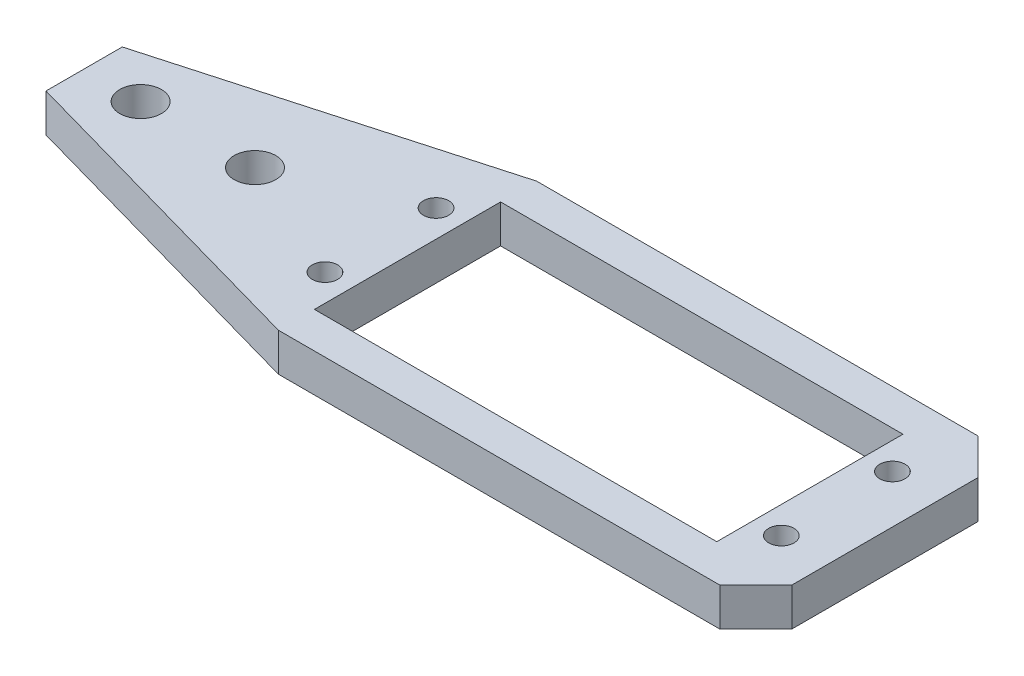
ISO-10303-21;
HEADER;
FILE_DESCRIPTION(('STEP AP214'),'2;1');
FILE_NAME('part.step','',(''),(''),'','','');
FILE_SCHEMA(('AUTOMOTIVE_DESIGN { 1 0 10303 214 1 1 1 1 }'));
ENDSEC;
DATA;
#1=APPLICATION_CONTEXT('core data for automotive mechanical design processes');
#2=APPLICATION_PROTOCOL_DEFINITION('international standard','automotive_design',2000,#1);
#3=PRODUCT_CONTEXT('',#1,'mechanical');
#4=PRODUCT('Part','Part','',(#3));
#5=PRODUCT_RELATED_PRODUCT_CATEGORY('part','',(#4));
#6=PRODUCT_DEFINITION_FORMATION('','',#4);
#7=PRODUCT_DEFINITION_CONTEXT('part definition',#1,'design');
#8=PRODUCT_DEFINITION('design','',#6,#7);
#9=PRODUCT_DEFINITION_SHAPE('','',#8);
#10=(LENGTH_UNIT() NAMED_UNIT(*) SI_UNIT(.MILLI.,.METRE.));
#11=(NAMED_UNIT(*) PLANE_ANGLE_UNIT() SI_UNIT($,.RADIAN.));
#12=(NAMED_UNIT(*) SI_UNIT($,.STERADIAN.) SOLID_ANGLE_UNIT());
#13=UNCERTAINTY_MEASURE_WITH_UNIT(LENGTH_MEASURE(1.E-05),#10,'distance_accuracy_value','');
#14=(GEOMETRIC_REPRESENTATION_CONTEXT(3) GLOBAL_UNCERTAINTY_ASSIGNED_CONTEXT((#13)) GLOBAL_UNIT_ASSIGNED_CONTEXT((#10,
#11,#12)) REPRESENTATION_CONTEXT('',''));
#15=CARTESIAN_POINT('',(0.,0.,0.));
#16=DIRECTION('',(0.,0.,1.));
#17=DIRECTION('',(1.,0.,0.));
#18=AXIS2_PLACEMENT_3D('',#15,#16,#17);
#19=CARTESIAN_POINT('',(0.,6.35,0.));
#20=DIRECTION('',(0.,1.,0.));
#21=DIRECTION('',(0.,0.,1.));
#22=AXIS2_PLACEMENT_3D('',#19,#20,#21);
#23=PLANE('',#22);
#24=CARTESIAN_POINT('',(-57.275,6.35,0.));
#25=DIRECTION('',(0.,1.,0.));
#26=DIRECTION('',(0.,0.,1.));
#27=AXIS2_PLACEMENT_3D('',#24,#25,#26);
#28=CIRCLE('',#27,3.475);
#29=CARTESIAN_POINT('',(-57.275,6.35,3.475));
#30=VERTEX_POINT('',#29);
#31=EDGE_CURVE('E328',#30,#30,#28,.T.);
#32=ORIENTED_EDGE('',*,*,#31,.F.);
#33=EDGE_LOOP('',(#32));
#34=FACE_BOUND('',#33,.T.);
#35=CARTESIAN_POINT('',(-17.325,6.35,9.25));
#36=DIRECTION('',(0.,1.,0.));
#37=DIRECTION('',(0.,0.,1.));
#38=AXIS2_PLACEMENT_3D('',#35,#36,#37);
#39=CIRCLE('',#38,2.1082);
#40=CARTESIAN_POINT('',(-17.325,6.35,11.3582));
#41=VERTEX_POINT('',#40);
#42=EDGE_CURVE('E340',#41,#41,#39,.T.);
#43=ORIENTED_EDGE('',*,*,#42,.F.);
#44=EDGE_LOOP('',(#43));
#45=FACE_BOUND('',#44,.T.);
#46=CARTESIAN_POINT('',(58.675,6.35,-9.24999999999999));
#47=DIRECTION('',(0.,1.,0.));
#48=DIRECTION('',(0.,0.,1.));
#49=AXIS2_PLACEMENT_3D('',#46,#47,#48);
#50=CIRCLE('',#49,2.10819999999999);
#51=CARTESIAN_POINT('',(58.675,6.35,-7.1418));
#52=VERTEX_POINT('',#51);
#53=EDGE_CURVE('E151',#52,#52,#50,.T.);
#54=ORIENTED_EDGE('',*,*,#53,.F.);
#55=EDGE_LOOP('',(#54));
#56=FACE_BOUND('',#55,.T.);
#57=DIRECTION('',(-0.962629097417592,0.,0.270823227964281));
#58=VECTOR('',#57,1.);
#59=CARTESIAN_POINT('',(-66.675,6.35,-6.35));
#60=LINE('',#59,#58);
#61=CARTESIAN_POINT('',(-12.825,6.35,-21.5));
#62=VERTEX_POINT('',#61);
#63=CARTESIAN_POINT('',(-66.675,6.35,-6.35));
#64=VERTEX_POINT('',#63);
#65=EDGE_CURVE('E161',#62,#64,#60,.T.);
#66=ORIENTED_EDGE('',*,*,#65,.T.);
#67=DIRECTION('',(0.,0.,1.));
#68=VECTOR('',#67,1.);
#69=CARTESIAN_POINT('',(-66.675,6.35,6.35));
#70=LINE('',#69,#68);
#71=CARTESIAN_POINT('',(-66.675,6.35,6.35));
#72=VERTEX_POINT('',#71);
#73=EDGE_CURVE('E164',#64,#72,#70,.T.);
#74=ORIENTED_EDGE('',*,*,#73,.T.);
#75=DIRECTION('',(0.962629097417592,0.,0.270823227964281));
#76=VECTOR('',#75,1.);
#77=CARTESIAN_POINT('',(-66.675,6.35,6.35));
#78=LINE('',#77,#76);
#79=CARTESIAN_POINT('',(-12.825,6.35,21.5));
#80=VERTEX_POINT('',#79);
#81=EDGE_CURVE('E167',#72,#80,#78,.T.);
#82=ORIENTED_EDGE('',*,*,#81,.T.);
#83=DIRECTION('',(1.,0.,0.));
#84=VECTOR('',#83,1.);
#85=CARTESIAN_POINT('',(60.6750000000001,6.35,21.5));
#86=LINE('',#85,#84);
#87=CARTESIAN_POINT('',(60.6750000000001,6.35,21.5));
#88=VERTEX_POINT('',#87);
#89=EDGE_CURVE('E169',#80,#88,#86,.T.);
#90=ORIENTED_EDGE('',*,*,#89,.T.);
#91=DIRECTION('',(0.707106781186541,0.,-0.707106781186554));
#92=VECTOR('',#91,1.);
#93=CARTESIAN_POINT('',(66.675,6.35,15.5));
#94=LINE('',#93,#92);
#95=CARTESIAN_POINT('',(66.675,6.35,15.5));
#96=VERTEX_POINT('',#95);
#97=EDGE_CURVE('E171',#88,#96,#94,.T.);
#98=ORIENTED_EDGE('',*,*,#97,.T.);
#99=DIRECTION('',(0.,0.,-1.));
#100=VECTOR('',#99,1.);
#101=CARTESIAN_POINT('',(66.675,6.35,15.5));
#102=LINE('',#101,#100);
#103=CARTESIAN_POINT('',(66.675,6.35,-15.5000000000002));
#104=VERTEX_POINT('',#103);
#105=EDGE_CURVE('E173',#96,#104,#102,.T.);
#106=ORIENTED_EDGE('',*,*,#105,.T.);
#107=DIRECTION('',(-0.707106781186553,0.,-0.707106781186542));
#108=VECTOR('',#107,1.);
#109=CARTESIAN_POINT('',(60.6750000000001,6.35,-21.5));
#110=LINE('',#109,#108);
#111=CARTESIAN_POINT('',(60.6750000000001,6.35,-21.5));
#112=VERTEX_POINT('',#111);
#113=EDGE_CURVE('E175',#104,#112,#110,.T.);
#114=ORIENTED_EDGE('',*,*,#113,.T.);
#115=DIRECTION('',(-1.,0.,0.));
#116=VECTOR('',#115,1.);
#117=CARTESIAN_POINT('',(60.6750000000001,6.35,-21.5));
#118=LINE('',#117,#116);
#119=EDGE_CURVE('E177',#112,#62,#118,.T.);
#120=ORIENTED_EDGE('',*,*,#119,.T.);
#121=EDGE_LOOP('',(#66,#74,#82,#90,#98,#106,#114,#120));
#122=FACE_BOUND('',#121,.T.);
#123=DIRECTION('',(1.,0.,0.));
#124=VECTOR('',#123,1.);
#125=CARTESIAN_POINT('',(54.175,6.35,15.5));
#126=LINE('',#125,#124);
#127=CARTESIAN_POINT('',(-12.825,6.35,15.5));
#128=VERTEX_POINT('',#127);
#129=CARTESIAN_POINT('',(54.175,6.35,15.5));
#130=VERTEX_POINT('',#129);
#131=EDGE_CURVE('E130',#128,#130,#126,.T.);
#132=ORIENTED_EDGE('',*,*,#131,.F.);
#133=DIRECTION('',(0.,0.,1.));
#134=VECTOR('',#133,1.);
#135=CARTESIAN_POINT('',(-12.825,6.35,15.5));
#136=LINE('',#135,#134);
#137=CARTESIAN_POINT('',(-12.825,6.35,-15.5));
#138=VERTEX_POINT('',#137);
#139=EDGE_CURVE('E122',#138,#128,#136,.T.);
#140=ORIENTED_EDGE('',*,*,#139,.F.);
#141=DIRECTION('',(-1.,0.,0.));
#142=VECTOR('',#141,1.);
#143=CARTESIAN_POINT('',(54.175,6.35,-15.5));
#144=LINE('',#143,#142);
#145=CARTESIAN_POINT('',(54.175,6.35,-15.5));
#146=VERTEX_POINT('',#145);
#147=EDGE_CURVE('E145',#146,#138,#144,.T.);
#148=ORIENTED_EDGE('',*,*,#147,.F.);
#149=DIRECTION('',(0.,0.,-1.));
#150=VECTOR('',#149,1.);
#151=CARTESIAN_POINT('',(54.175,6.35,15.5));
#152=LINE('',#151,#150);
#153=EDGE_CURVE('E143',#130,#146,#152,.T.);
#154=ORIENTED_EDGE('',*,*,#153,.F.);
#155=EDGE_LOOP('',(#132,#140,#148,#154));
#156=FACE_BOUND('',#155,.T.);
#157=CARTESIAN_POINT('',(58.675,6.35,9.24999999999999));
#158=DIRECTION('',(0.,1.,0.));
#159=DIRECTION('',(0.,0.,-1.));
#160=AXIS2_PLACEMENT_3D('',#157,#158,#159);
#161=CIRCLE('',#160,2.10819999999999);
#162=CARTESIAN_POINT('',(58.675,6.35,7.1418));
#163=VERTEX_POINT('',#162);
#164=EDGE_CURVE('E346',#163,#163,#161,.T.);
#165=ORIENTED_EDGE('',*,*,#164,.F.);
#166=EDGE_LOOP('',(#165));
#167=FACE_BOUND('',#166,.T.);
#168=CARTESIAN_POINT('',(-17.325,6.35,-9.25));
#169=DIRECTION('',(0.,1.,0.));
#170=DIRECTION('',(0.,0.,-1.));
#171=AXIS2_PLACEMENT_3D('',#168,#169,#170);
#172=CIRCLE('',#171,2.1082);
#173=CARTESIAN_POINT('',(-17.325,6.35,-11.3582));
#174=VERTEX_POINT('',#173);
#175=EDGE_CURVE('E334',#174,#174,#172,.T.);
#176=ORIENTED_EDGE('',*,*,#175,.F.);
#177=EDGE_LOOP('',(#176));
#178=FACE_BOUND('',#177,.T.);
#179=CARTESIAN_POINT('',(-38.225,6.35,0.));
#180=DIRECTION('',(0.,1.,0.));
#181=DIRECTION('',(0.,0.,1.));
#182=AXIS2_PLACEMENT_3D('',#179,#180,#181);
#183=CIRCLE('',#182,3.47500000000001);
#184=CARTESIAN_POINT('',(-38.225,6.35,3.47500000000001));
#185=VERTEX_POINT('',#184);
#186=EDGE_CURVE('E319',#185,#185,#183,.T.);
#187=ORIENTED_EDGE('',*,*,#186,.F.);
#188=EDGE_LOOP('',(#187));
#189=FACE_BOUND('',#188,.T.);
#190=ADVANCED_FACE('F33',(#34,#45,#56,#122,#156,#167,#178,#189),#23,.T.);
#191=CARTESIAN_POINT('',(0.,0.,0.));
#192=DIRECTION('',(0.,1.,0.));
#193=DIRECTION('',(0.,0.,1.));
#194=AXIS2_PLACEMENT_3D('',#191,#192,#193);
#195=PLANE('',#194);
#196=CARTESIAN_POINT('',(-57.275,0.,0.));
#197=DIRECTION('',(0.,1.,0.));
#198=DIRECTION('',(0.,0.,1.));
#199=AXIS2_PLACEMENT_3D('',#196,#197,#198);
#200=CIRCLE('',#199,3.475);
#201=CARTESIAN_POINT('',(-57.275,0.,3.475));
#202=VERTEX_POINT('',#201);
#203=EDGE_CURVE('E325',#202,#202,#200,.T.);
#204=ORIENTED_EDGE('',*,*,#203,.T.);
#205=EDGE_LOOP('',(#204));
#206=FACE_BOUND('',#205,.T.);
#207=CARTESIAN_POINT('',(-17.325,0.,9.25));
#208=DIRECTION('',(0.,1.,0.));
#209=DIRECTION('',(0.,0.,1.));
#210=AXIS2_PLACEMENT_3D('',#207,#208,#209);
#211=CIRCLE('',#210,2.1082);
#212=CARTESIAN_POINT('',(-17.325,0.,11.3582));
#213=VERTEX_POINT('',#212);
#214=EDGE_CURVE('E337',#213,#213,#211,.T.);
#215=ORIENTED_EDGE('',*,*,#214,.T.);
#216=EDGE_LOOP('',(#215));
#217=FACE_BOUND('',#216,.T.);
#218=CARTESIAN_POINT('',(58.675,0.,-9.24999999999999));
#219=DIRECTION('',(0.,1.,0.));
#220=DIRECTION('',(0.,0.,1.));
#221=AXIS2_PLACEMENT_3D('',#218,#219,#220);
#222=CIRCLE('',#221,2.10819999999999);
#223=CARTESIAN_POINT('',(58.675,0.,-7.1418));
#224=VERTEX_POINT('',#223);
#225=EDGE_CURVE('E349',#224,#224,#222,.T.);
#226=ORIENTED_EDGE('',*,*,#225,.T.);
#227=EDGE_LOOP('',(#226));
#228=FACE_BOUND('',#227,.T.);
#229=DIRECTION('',(-0.962629097417592,0.,0.270823227964281));
#230=VECTOR('',#229,1.);
#231=CARTESIAN_POINT('',(-66.675,0.,-6.35));
#232=LINE('',#231,#230);
#233=CARTESIAN_POINT('',(-12.825,0.,-21.5));
#234=VERTEX_POINT('',#233);
#235=CARTESIAN_POINT('',(-66.675,0.,-6.35));
#236=VERTEX_POINT('',#235);
#237=EDGE_CURVE('E138',#234,#236,#232,.T.);
#238=ORIENTED_EDGE('',*,*,#237,.F.);
#239=DIRECTION('',(-1.,0.,0.));
#240=VECTOR('',#239,1.);
#241=CARTESIAN_POINT('',(60.6750000000001,0.,-21.5));
#242=LINE('',#241,#240);
#243=CARTESIAN_POINT('',(60.6750000000001,0.,-21.5));
#244=VERTEX_POINT('',#243);
#245=EDGE_CURVE('E165',#244,#234,#242,.T.);
#246=ORIENTED_EDGE('',*,*,#245,.F.);
#247=DIRECTION('',(-0.707106781186553,0.,-0.707106781186542));
#248=VECTOR('',#247,1.);
#249=CARTESIAN_POINT('',(60.6750000000001,0.,-21.5));
#250=LINE('',#249,#248);
#251=CARTESIAN_POINT('',(66.675,0.,-15.5000000000002));
#252=VERTEX_POINT('',#251);
#253=EDGE_CURVE('E192',#252,#244,#250,.T.);
#254=ORIENTED_EDGE('',*,*,#253,.F.);
#255=DIRECTION('',(0.,0.,-1.));
#256=VECTOR('',#255,1.);
#257=CARTESIAN_POINT('',(66.675,0.,15.5));
#258=LINE('',#257,#256);
#259=CARTESIAN_POINT('',(66.675,0.,15.5));
#260=VERTEX_POINT('',#259);
#261=EDGE_CURVE('E190',#260,#252,#258,.T.);
#262=ORIENTED_EDGE('',*,*,#261,.F.);
#263=DIRECTION('',(0.707106781186541,0.,-0.707106781186554));
#264=VECTOR('',#263,1.);
#265=CARTESIAN_POINT('',(66.675,0.,15.5));
#266=LINE('',#265,#264);
#267=CARTESIAN_POINT('',(60.6750000000001,0.,21.5));
#268=VERTEX_POINT('',#267);
#269=EDGE_CURVE('E188',#268,#260,#266,.T.);
#270=ORIENTED_EDGE('',*,*,#269,.F.);
#271=DIRECTION('',(1.,0.,0.));
#272=VECTOR('',#271,1.);
#273=CARTESIAN_POINT('',(60.6750000000001,0.,21.5));
#274=LINE('',#273,#272);
#275=CARTESIAN_POINT('',(-12.825,0.,21.5));
#276=VERTEX_POINT('',#275);
#277=EDGE_CURVE('E186',#276,#268,#274,.T.);
#278=ORIENTED_EDGE('',*,*,#277,.F.);
#279=DIRECTION('',(0.962629097417592,0.,0.270823227964281));
#280=VECTOR('',#279,1.);
#281=CARTESIAN_POINT('',(-66.675,0.,6.35));
#282=LINE('',#281,#280);
#283=CARTESIAN_POINT('',(-66.675,0.,6.35));
#284=VERTEX_POINT('',#283);
#285=EDGE_CURVE('E184',#284,#276,#282,.T.);
#286=ORIENTED_EDGE('',*,*,#285,.F.);
#287=DIRECTION('',(0.,0.,1.));
#288=VECTOR('',#287,1.);
#289=CARTESIAN_POINT('',(-66.675,0.,6.35));
#290=LINE('',#289,#288);
#291=EDGE_CURVE('E182',#236,#284,#290,.T.);
#292=ORIENTED_EDGE('',*,*,#291,.F.);
#293=EDGE_LOOP('',(#238,#246,#254,#262,#270,#278,#286,#292));
#294=FACE_BOUND('',#293,.T.);
#295=DIRECTION('',(0.,0.,1.));
#296=VECTOR('',#295,1.);
#297=CARTESIAN_POINT('',(-12.825,0.,15.5));
#298=LINE('',#297,#296);
#299=CARTESIAN_POINT('',(-12.825,0.,-15.5));
#300=VERTEX_POINT('',#299);
#301=CARTESIAN_POINT('',(-12.825,0.,15.5));
#302=VERTEX_POINT('',#301);
#303=EDGE_CURVE('E56',#300,#302,#298,.T.);
#304=ORIENTED_EDGE('',*,*,#303,.T.);
#305=DIRECTION('',(1.,0.,0.));
#306=VECTOR('',#305,1.);
#307=CARTESIAN_POINT('',(54.175,0.,15.5));
#308=LINE('',#307,#306);
#309=CARTESIAN_POINT('',(54.175,0.,15.5));
#310=VERTEX_POINT('',#309);
#311=EDGE_CURVE('E137',#302,#310,#308,.T.);
#312=ORIENTED_EDGE('',*,*,#311,.T.);
#313=DIRECTION('',(0.,0.,-1.));
#314=VECTOR('',#313,1.);
#315=CARTESIAN_POINT('',(54.175,0.,15.5));
#316=LINE('',#315,#314);
#317=CARTESIAN_POINT('',(54.175,0.,-15.5));
#318=VERTEX_POINT('',#317);
#319=EDGE_CURVE('E153',#310,#318,#316,.T.);
#320=ORIENTED_EDGE('',*,*,#319,.T.);
#321=DIRECTION('',(-1.,0.,0.));
#322=VECTOR('',#321,1.);
#323=CARTESIAN_POINT('',(54.175,0.,-15.5));
#324=LINE('',#323,#322);
#325=EDGE_CURVE('E131',#318,#300,#324,.T.);
#326=ORIENTED_EDGE('',*,*,#325,.T.);
#327=EDGE_LOOP('',(#304,#312,#320,#326));
#328=FACE_BOUND('',#327,.T.);
#329=CARTESIAN_POINT('',(58.675,0.,9.24999999999999));
#330=DIRECTION('',(0.,1.,0.));
#331=DIRECTION('',(0.,0.,-1.));
#332=AXIS2_PLACEMENT_3D('',#329,#330,#331);
#333=CIRCLE('',#332,2.10819999999999);
#334=CARTESIAN_POINT('',(58.675,0.,7.1418));
#335=VERTEX_POINT('',#334);
#336=EDGE_CURVE('E343',#335,#335,#333,.T.);
#337=ORIENTED_EDGE('',*,*,#336,.T.);
#338=EDGE_LOOP('',(#337));
#339=FACE_BOUND('',#338,.T.);
#340=CARTESIAN_POINT('',(-17.325,0.,-9.25));
#341=DIRECTION('',(0.,1.,0.));
#342=DIRECTION('',(0.,0.,-1.));
#343=AXIS2_PLACEMENT_3D('',#340,#341,#342);
#344=CIRCLE('',#343,2.1082);
#345=CARTESIAN_POINT('',(-17.325,0.,-11.3582));
#346=VERTEX_POINT('',#345);
#347=EDGE_CURVE('E331',#346,#346,#344,.T.);
#348=ORIENTED_EDGE('',*,*,#347,.T.);
#349=EDGE_LOOP('',(#348));
#350=FACE_BOUND('',#349,.T.);
#351=CARTESIAN_POINT('',(-38.225,0.,0.));
#352=DIRECTION('',(0.,1.,0.));
#353=DIRECTION('',(0.,0.,1.));
#354=AXIS2_PLACEMENT_3D('',#351,#352,#353);
#355=CIRCLE('',#354,3.47500000000001);
#356=CARTESIAN_POINT('',(-38.225,0.,3.47500000000001));
#357=VERTEX_POINT('',#356);
#358=EDGE_CURVE('E322',#357,#357,#355,.T.);
#359=ORIENTED_EDGE('',*,*,#358,.T.);
#360=EDGE_LOOP('',(#359));
#361=FACE_BOUND('',#360,.T.);
#362=ADVANCED_FACE('F222',(#206,#217,#228,#294,#328,#339,#350,#361),#195,.F.);
#363=CARTESIAN_POINT('',(-66.675,6.35,-6.35));
#364=DIRECTION('',(0.270823227964281,0.,0.962629097417592));
#365=DIRECTION('',(0.962629097417592,0.,-0.270823227964281));
#366=AXIS2_PLACEMENT_3D('',#363,#364,#365);
#367=PLANE('',#366);
#368=ORIENTED_EDGE('',*,*,#237,.T.);
#369=DIRECTION('',(0.,-1.,0.));
#370=VECTOR('',#369,1.);
#371=CARTESIAN_POINT('',(-66.675,6.35,-6.35));
#372=LINE('',#371,#370);
#373=EDGE_CURVE('E11',#64,#236,#372,.T.);
#374=ORIENTED_EDGE('',*,*,#373,.F.);
#375=ORIENTED_EDGE('',*,*,#65,.F.);
#376=DIRECTION('',(0.,-1.,0.));
#377=VECTOR('',#376,1.);
#378=CARTESIAN_POINT('',(-12.825,6.35,-21.5));
#379=LINE('',#378,#377);
#380=EDGE_CURVE('E179',#62,#234,#379,.T.);
#381=ORIENTED_EDGE('',*,*,#380,.T.);
#382=EDGE_LOOP('',(#368,#374,#375,#381));
#383=FACE_BOUND('',#382,.T.);
#384=ADVANCED_FACE('F35',(#383),#367,.F.);
#385=CARTESIAN_POINT('',(-66.675,6.35,6.35));
#386=DIRECTION('',(1.,0.,0.));
#387=DIRECTION('',(0.,0.,-1.));
#388=AXIS2_PLACEMENT_3D('',#385,#386,#387);
#389=PLANE('',#388);
#390=ORIENTED_EDGE('',*,*,#291,.T.);
#391=DIRECTION('',(0.,-1.,0.));
#392=VECTOR('',#391,1.);
#393=CARTESIAN_POINT('',(-66.675,6.35,6.35));
#394=LINE('',#393,#392);
#395=EDGE_CURVE('E41',#72,#284,#394,.T.);
#396=ORIENTED_EDGE('',*,*,#395,.F.);
#397=ORIENTED_EDGE('',*,*,#73,.F.);
#398=ORIENTED_EDGE('',*,*,#373,.T.);
#399=EDGE_LOOP('',(#390,#396,#397,#398));
#400=FACE_BOUND('',#399,.T.);
#401=ADVANCED_FACE('F239',(#400),#389,.F.);
#402=CARTESIAN_POINT('',(-66.675,6.35,6.35));
#403=DIRECTION('',(0.270823227964281,0.,-0.962629097417592));
#404=DIRECTION('',(-0.962629097417592,0.,-0.270823227964281));
#405=AXIS2_PLACEMENT_3D('',#402,#403,#404);
#406=PLANE('',#405);
#407=ORIENTED_EDGE('',*,*,#285,.T.);
#408=DIRECTION('',(0.,-1.,0.));
#409=VECTOR('',#408,1.);
#410=CARTESIAN_POINT('',(-12.825,6.35,21.5));
#411=LINE('',#410,#409);
#412=EDGE_CURVE('E209',#80,#276,#411,.T.);
#413=ORIENTED_EDGE('',*,*,#412,.F.);
#414=ORIENTED_EDGE('',*,*,#81,.F.);
#415=ORIENTED_EDGE('',*,*,#395,.T.);
#416=EDGE_LOOP('',(#407,#413,#414,#415));
#417=FACE_BOUND('',#416,.T.);
#418=ADVANCED_FACE('F216',(#417),#406,.F.);
#419=CARTESIAN_POINT('',(60.6750000000001,6.35,21.5));
#420=DIRECTION('',(0.,0.,-1.));
#421=DIRECTION('',(-1.,0.,0.));
#422=AXIS2_PLACEMENT_3D('',#419,#420,#421);
#423=PLANE('',#422);
#424=ORIENTED_EDGE('',*,*,#277,.T.);
#425=DIRECTION('',(0.,-1.,0.));
#426=VECTOR('',#425,1.);
#427=CARTESIAN_POINT('',(60.6750000000001,6.35,21.5));
#428=LINE('',#427,#426);
#429=EDGE_CURVE('E206',#88,#268,#428,.T.);
#430=ORIENTED_EDGE('',*,*,#429,.F.);
#431=ORIENTED_EDGE('',*,*,#89,.F.);
#432=ORIENTED_EDGE('',*,*,#412,.T.);
#433=EDGE_LOOP('',(#424,#430,#431,#432));
#434=FACE_BOUND('',#433,.T.);
#435=ADVANCED_FACE('F228',(#434),#423,.F.);
#436=CARTESIAN_POINT('',(66.675,6.35,15.5));
#437=DIRECTION('',(-0.707106781186554,0.,-0.707106781186541));
#438=DIRECTION('',(-0.707106781186541,0.,0.707106781186554));
#439=AXIS2_PLACEMENT_3D('',#436,#437,#438);
#440=PLANE('',#439);
#441=ORIENTED_EDGE('',*,*,#269,.T.);
#442=DIRECTION('',(0.,-1.,0.));
#443=VECTOR('',#442,1.);
#444=CARTESIAN_POINT('',(66.675,6.35,15.5));
#445=LINE('',#444,#443);
#446=EDGE_CURVE('E203',#96,#260,#445,.T.);
#447=ORIENTED_EDGE('',*,*,#446,.F.);
#448=ORIENTED_EDGE('',*,*,#97,.F.);
#449=ORIENTED_EDGE('',*,*,#429,.T.);
#450=EDGE_LOOP('',(#441,#447,#448,#449));
#451=FACE_BOUND('',#450,.T.);
#452=ADVANCED_FACE('F232',(#451),#440,.F.);
#453=CARTESIAN_POINT('',(66.675,6.35,15.5));
#454=DIRECTION('',(-1.,0.,0.));
#455=DIRECTION('',(0.,0.,1.));
#456=AXIS2_PLACEMENT_3D('',#453,#454,#455);
#457=PLANE('',#456);
#458=ORIENTED_EDGE('',*,*,#261,.T.);
#459=DIRECTION('',(0.,-1.,0.));
#460=VECTOR('',#459,1.);
#461=CARTESIAN_POINT('',(66.675,6.35,-15.5000000000002));
#462=LINE('',#461,#460);
#463=EDGE_CURVE('E200',#104,#252,#462,.T.);
#464=ORIENTED_EDGE('',*,*,#463,.F.);
#465=ORIENTED_EDGE('',*,*,#105,.F.);
#466=ORIENTED_EDGE('',*,*,#446,.T.);
#467=EDGE_LOOP('',(#458,#464,#465,#466));
#468=FACE_BOUND('',#467,.T.);
#469=ADVANCED_FACE('F252',(#468),#457,.F.);
#470=CARTESIAN_POINT('',(60.6750000000001,6.35,-21.5));
#471=DIRECTION('',(-0.707106781186542,0.,0.707106781186553));
#472=DIRECTION('',(0.707106781186553,0.,0.707106781186542));
#473=AXIS2_PLACEMENT_3D('',#470,#471,#472);
#474=PLANE('',#473);
#475=ORIENTED_EDGE('',*,*,#253,.T.);
#476=DIRECTION('',(0.,-1.,0.));
#477=VECTOR('',#476,1.);
#478=CARTESIAN_POINT('',(60.6750000000001,6.35,-21.5));
#479=LINE('',#478,#477);
#480=EDGE_CURVE('E197',#112,#244,#479,.T.);
#481=ORIENTED_EDGE('',*,*,#480,.F.);
#482=ORIENTED_EDGE('',*,*,#113,.F.);
#483=ORIENTED_EDGE('',*,*,#463,.T.);
#484=EDGE_LOOP('',(#475,#481,#482,#483));
#485=FACE_BOUND('',#484,.T.);
#486=ADVANCED_FACE('F250',(#485),#474,.F.);
#487=CARTESIAN_POINT('',(60.6750000000001,6.35,-21.5));
#488=DIRECTION('',(0.,0.,1.));
#489=DIRECTION('',(1.,0.,0.));
#490=AXIS2_PLACEMENT_3D('',#487,#488,#489);
#491=PLANE('',#490);
#492=ORIENTED_EDGE('',*,*,#245,.T.);
#493=ORIENTED_EDGE('',*,*,#380,.F.);
#494=ORIENTED_EDGE('',*,*,#119,.F.);
#495=ORIENTED_EDGE('',*,*,#480,.T.);
#496=EDGE_LOOP('',(#492,#493,#494,#495));
#497=FACE_BOUND('',#496,.T.);
#498=ADVANCED_FACE('F245',(#497),#491,.F.);
#499=CARTESIAN_POINT('',(-12.825,6.35,15.5));
#500=DIRECTION('',(1.,0.,0.));
#501=DIRECTION('',(0.,0.,-1.));
#502=AXIS2_PLACEMENT_3D('',#499,#500,#501);
#503=PLANE('',#502);
#504=ORIENTED_EDGE('',*,*,#303,.F.);
#505=DIRECTION('',(0.,-1.,0.));
#506=VECTOR('',#505,1.);
#507=CARTESIAN_POINT('',(-12.825,6.35,-15.5));
#508=LINE('',#507,#506);
#509=EDGE_CURVE('E126',#138,#300,#508,.T.);
#510=ORIENTED_EDGE('',*,*,#509,.F.);
#511=ORIENTED_EDGE('',*,*,#139,.T.);
#512=DIRECTION('',(0.,-1.,0.));
#513=VECTOR('',#512,1.);
#514=CARTESIAN_POINT('',(-12.825,6.35,15.5));
#515=LINE('',#514,#513);
#516=EDGE_CURVE('E125',#128,#302,#515,.T.);
#517=ORIENTED_EDGE('',*,*,#516,.T.);
#518=EDGE_LOOP('',(#504,#510,#511,#517));
#519=FACE_BOUND('',#518,.T.);
#520=ADVANCED_FACE('F124',(#519),#503,.T.);
#521=CARTESIAN_POINT('',(54.175,6.35,15.5));
#522=DIRECTION('',(0.,0.,-1.));
#523=DIRECTION('',(-1.,0.,0.));
#524=AXIS2_PLACEMENT_3D('',#521,#522,#523);
#525=PLANE('',#524);
#526=ORIENTED_EDGE('',*,*,#311,.F.);
#527=ORIENTED_EDGE('',*,*,#516,.F.);
#528=ORIENTED_EDGE('',*,*,#131,.T.);
#529=DIRECTION('',(0.,-1.,0.));
#530=VECTOR('',#529,1.);
#531=CARTESIAN_POINT('',(54.175,6.35,15.5));
#532=LINE('',#531,#530);
#533=EDGE_CURVE('E139',#130,#310,#532,.T.);
#534=ORIENTED_EDGE('',*,*,#533,.T.);
#535=EDGE_LOOP('',(#526,#527,#528,#534));
#536=FACE_BOUND('',#535,.T.);
#537=ADVANCED_FACE('F134',(#536),#525,.T.);
#538=CARTESIAN_POINT('',(54.175,6.35,15.5));
#539=DIRECTION('',(-1.,0.,0.));
#540=DIRECTION('',(0.,0.,1.));
#541=AXIS2_PLACEMENT_3D('',#538,#539,#540);
#542=PLANE('',#541);
#543=ORIENTED_EDGE('',*,*,#319,.F.);
#544=ORIENTED_EDGE('',*,*,#533,.F.);
#545=ORIENTED_EDGE('',*,*,#153,.T.);
#546=DIRECTION('',(0.,-1.,0.));
#547=VECTOR('',#546,1.);
#548=CARTESIAN_POINT('',(54.175,6.35,-15.5));
#549=LINE('',#548,#547);
#550=EDGE_CURVE('E48',#146,#318,#549,.T.);
#551=ORIENTED_EDGE('',*,*,#550,.T.);
#552=EDGE_LOOP('',(#543,#544,#545,#551));
#553=FACE_BOUND('',#552,.T.);
#554=ADVANCED_FACE('F281',(#553),#542,.T.);
#555=CARTESIAN_POINT('',(54.175,6.35,-15.5));
#556=DIRECTION('',(0.,0.,1.));
#557=DIRECTION('',(1.,0.,0.));
#558=AXIS2_PLACEMENT_3D('',#555,#556,#557);
#559=PLANE('',#558);
#560=ORIENTED_EDGE('',*,*,#325,.F.);
#561=ORIENTED_EDGE('',*,*,#550,.F.);
#562=ORIENTED_EDGE('',*,*,#147,.T.);
#563=ORIENTED_EDGE('',*,*,#509,.T.);
#564=EDGE_LOOP('',(#560,#561,#562,#563));
#565=FACE_BOUND('',#564,.T.);
#566=ADVANCED_FACE('F285',(#565),#559,.T.);
#567=CARTESIAN_POINT('',(58.675,6.35,-9.24999999999999));
#568=DIRECTION('',(0.,-1.,0.));
#569=DIRECTION('',(0.,0.,-1.));
#570=AXIS2_PLACEMENT_3D('',#567,#568,#569);
#571=CYLINDRICAL_SURFACE('',#570,2.10819999999999);
#572=ORIENTED_EDGE('',*,*,#53,.T.);
#573=EDGE_LOOP('',(#572));
#574=FACE_BOUND('',#573,.T.);
#575=ORIENTED_EDGE('',*,*,#225,.F.);
#576=EDGE_LOOP('',(#575));
#577=FACE_BOUND('',#576,.T.);
#578=ADVANCED_FACE('F291',(#574,#577),#571,.F.);
#579=CARTESIAN_POINT('',(58.675,6.35,9.24999999999999));
#580=DIRECTION('',(0.,-1.,0.));
#581=DIRECTION('',(0.,0.,-1.));
#582=AXIS2_PLACEMENT_3D('',#579,#580,#581);
#583=CYLINDRICAL_SURFACE('',#582,2.10819999999999);
#584=ORIENTED_EDGE('',*,*,#164,.T.);
#585=EDGE_LOOP('',(#584));
#586=FACE_BOUND('',#585,.T.);
#587=ORIENTED_EDGE('',*,*,#336,.F.);
#588=EDGE_LOOP('',(#587));
#589=FACE_BOUND('',#588,.T.);
#590=ADVANCED_FACE('F294',(#586,#589),#583,.F.);
#591=CARTESIAN_POINT('',(-17.325,6.35,9.25));
#592=DIRECTION('',(0.,-1.,0.));
#593=DIRECTION('',(0.,0.,-1.));
#594=AXIS2_PLACEMENT_3D('',#591,#592,#593);
#595=CYLINDRICAL_SURFACE('',#594,2.1082);
#596=ORIENTED_EDGE('',*,*,#42,.T.);
#597=EDGE_LOOP('',(#596));
#598=FACE_BOUND('',#597,.T.);
#599=ORIENTED_EDGE('',*,*,#214,.F.);
#600=EDGE_LOOP('',(#599));
#601=FACE_BOUND('',#600,.T.);
#602=ADVANCED_FACE('F298',(#598,#601),#595,.F.);
#603=CARTESIAN_POINT('',(-17.325,6.35,-9.25));
#604=DIRECTION('',(0.,-1.,0.));
#605=DIRECTION('',(0.,0.,-1.));
#606=AXIS2_PLACEMENT_3D('',#603,#604,#605);
#607=CYLINDRICAL_SURFACE('',#606,2.1082);
#608=ORIENTED_EDGE('',*,*,#175,.T.);
#609=EDGE_LOOP('',(#608));
#610=FACE_BOUND('',#609,.T.);
#611=ORIENTED_EDGE('',*,*,#347,.F.);
#612=EDGE_LOOP('',(#611));
#613=FACE_BOUND('',#612,.T.);
#614=ADVANCED_FACE('F302',(#610,#613),#607,.F.);
#615=CARTESIAN_POINT('',(-57.275,6.35,0.));
#616=DIRECTION('',(0.,-1.,0.));
#617=DIRECTION('',(0.,0.,-1.));
#618=AXIS2_PLACEMENT_3D('',#615,#616,#617);
#619=CYLINDRICAL_SURFACE('',#618,3.475);
#620=ORIENTED_EDGE('',*,*,#31,.T.);
#621=EDGE_LOOP('',(#620));
#622=FACE_BOUND('',#621,.T.);
#623=ORIENTED_EDGE('',*,*,#203,.F.);
#624=EDGE_LOOP('',(#623));
#625=FACE_BOUND('',#624,.T.);
#626=ADVANCED_FACE('F306',(#622,#625),#619,.F.);
#627=CARTESIAN_POINT('',(-38.225,6.35,0.));
#628=DIRECTION('',(0.,-1.,0.));
#629=DIRECTION('',(0.,0.,-1.));
#630=AXIS2_PLACEMENT_3D('',#627,#628,#629);
#631=CYLINDRICAL_SURFACE('',#630,3.47500000000001);
#632=ORIENTED_EDGE('',*,*,#186,.T.);
#633=EDGE_LOOP('',(#632));
#634=FACE_BOUND('',#633,.T.);
#635=ORIENTED_EDGE('',*,*,#358,.F.);
#636=EDGE_LOOP('',(#635));
#637=FACE_BOUND('',#636,.T.);
#638=ADVANCED_FACE('F310',(#634,#637),#631,.F.);
#639=CLOSED_SHELL('',(#190,#362,#384,#401,#418,#435,#452,#469,#486,#498,#520,#537,#554,#566,
#578,#590,#602,#614,#626,#638));
#640=MANIFOLD_SOLID_BREP('B2',#639);
#641=ADVANCED_BREP_SHAPE_REPRESENTATION('',(#18,#640),#14);
#642=SHAPE_DEFINITION_REPRESENTATION(#9,#641);
ENDSEC;
END-ISO-10303-21;
